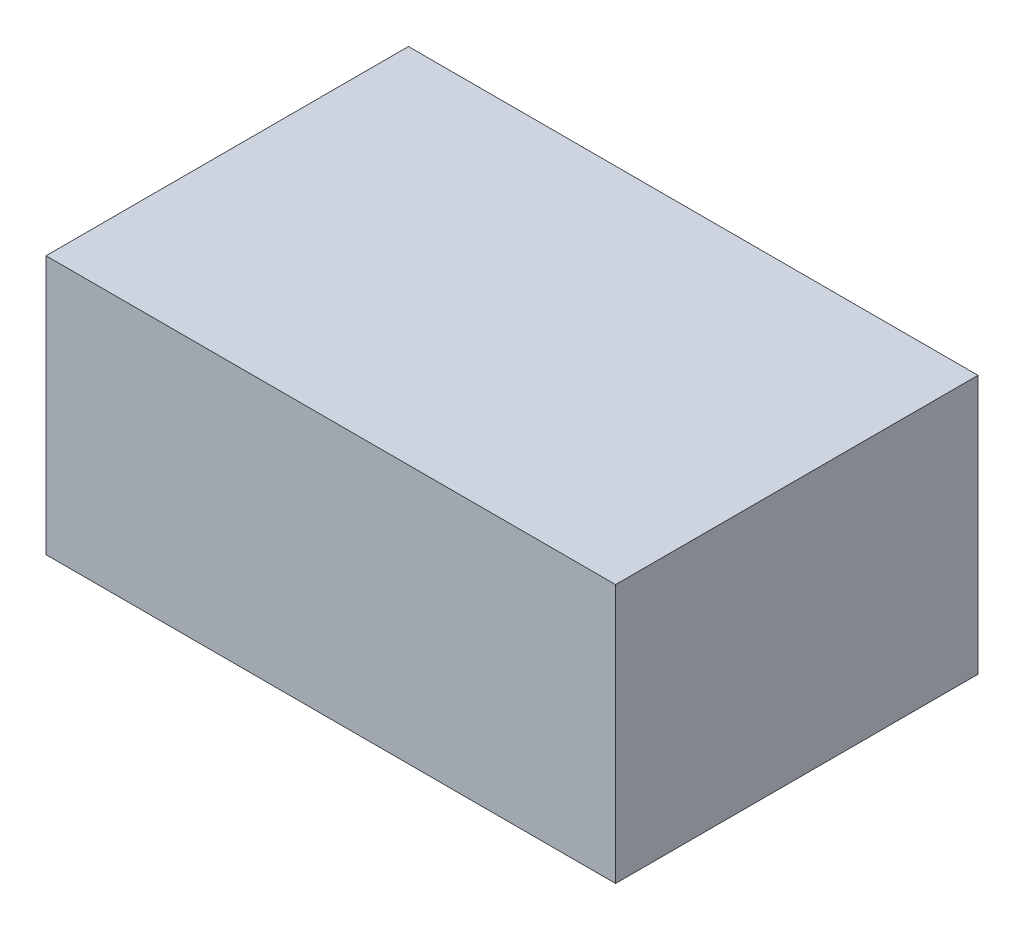
ISO-10303-21;
HEADER;
FILE_DESCRIPTION(('STEP AP214'),'2;1');
FILE_NAME('part.step','',(''),(''),'','','');
FILE_SCHEMA(('AUTOMOTIVE_DESIGN { 1 0 10303 214 1 1 1 1 }'));
ENDSEC;
DATA;
#1=APPLICATION_CONTEXT('core data for automotive mechanical design processes');
#2=APPLICATION_PROTOCOL_DEFINITION('international standard','automotive_design',2000,#1);
#3=PRODUCT_CONTEXT('',#1,'mechanical');
#4=PRODUCT('Part','Part','',(#3));
#5=PRODUCT_RELATED_PRODUCT_CATEGORY('part','',(#4));
#6=PRODUCT_DEFINITION_FORMATION('','',#4);
#7=PRODUCT_DEFINITION_CONTEXT('part definition',#1,'design');
#8=PRODUCT_DEFINITION('design','',#6,#7);
#9=PRODUCT_DEFINITION_SHAPE('','',#8);
#10=(LENGTH_UNIT() NAMED_UNIT(*) SI_UNIT(.MILLI.,.METRE.));
#11=(NAMED_UNIT(*) PLANE_ANGLE_UNIT() SI_UNIT($,.RADIAN.));
#12=(NAMED_UNIT(*) SI_UNIT($,.STERADIAN.) SOLID_ANGLE_UNIT());
#13=UNCERTAINTY_MEASURE_WITH_UNIT(LENGTH_MEASURE(1.E-05),#10,'distance_accuracy_value','');
#14=(GEOMETRIC_REPRESENTATION_CONTEXT(3) GLOBAL_UNCERTAINTY_ASSIGNED_CONTEXT((#13)) GLOBAL_UNIT_ASSIGNED_CONTEXT((#10,
#11,#12)) REPRESENTATION_CONTEXT('',''));
#15=CARTESIAN_POINT('',(0.,0.,0.));
#16=DIRECTION('',(0.,0.,1.));
#17=DIRECTION('',(1.,0.,0.));
#18=AXIS2_PLACEMENT_3D('',#15,#16,#17);
#19=CARTESIAN_POINT('',(27.5,-12.5,35.));
#20=DIRECTION('',(-1.,0.,0.));
#21=DIRECTION('',(0.,0.,1.));
#22=AXIS2_PLACEMENT_3D('',#19,#20,#21);
#23=PLANE('',#22);
#24=DIRECTION('',(0.,1.,0.));
#25=VECTOR('',#24,1.);
#26=CARTESIAN_POINT('',(27.5,-12.5,0.));
#27=LINE('',#26,#25);
#28=CARTESIAN_POINT('',(27.5,-12.5,0.));
#29=VERTEX_POINT('',#28);
#30=CARTESIAN_POINT('',(27.5,12.5,0.));
#31=VERTEX_POINT('',#30);
#32=EDGE_CURVE('E113',#29,#31,#27,.T.);
#33=ORIENTED_EDGE('',*,*,#32,.T.);
#34=DIRECTION('',(0.,0.,-1.));
#35=VECTOR('',#34,1.);
#36=CARTESIAN_POINT('',(27.5,12.5,35.));
#37=LINE('',#36,#35);
#38=CARTESIAN_POINT('',(27.5,12.5,35.));
#39=VERTEX_POINT('',#38);
#40=EDGE_CURVE('E11',#39,#31,#37,.T.);
#41=ORIENTED_EDGE('',*,*,#40,.F.);
#42=DIRECTION('',(0.,1.,0.));
#43=VECTOR('',#42,1.);
#44=CARTESIAN_POINT('',(27.5,-12.5,35.));
#45=LINE('',#44,#43);
#46=CARTESIAN_POINT('',(27.5,-12.5,35.));
#47=VERTEX_POINT('',#46);
#48=EDGE_CURVE('E97',#47,#39,#45,.T.);
#49=ORIENTED_EDGE('',*,*,#48,.F.);
#50=DIRECTION('',(0.,0.,-1.));
#51=VECTOR('',#50,1.);
#52=CARTESIAN_POINT('',(27.5,-12.5,35.));
#53=LINE('',#52,#51);
#54=EDGE_CURVE('E109',#47,#29,#53,.T.);
#55=ORIENTED_EDGE('',*,*,#54,.T.);
#56=EDGE_LOOP('',(#33,#41,#49,#55));
#57=FACE_BOUND('',#56,.T.);
#58=ADVANCED_FACE('F45',(#57),#23,.F.);
#59=CARTESIAN_POINT('',(-27.5,12.5,35.));
#60=DIRECTION('',(0.,-1.,0.));
#61=DIRECTION('',(0.,0.,-1.));
#62=AXIS2_PLACEMENT_3D('',#59,#60,#61);
#63=PLANE('',#62);
#64=DIRECTION('',(-1.,0.,0.));
#65=VECTOR('',#64,1.);
#66=CARTESIAN_POINT('',(-27.5,12.5,0.));
#67=LINE('',#66,#65);
#68=CARTESIAN_POINT('',(-27.5,12.5,0.));
#69=VERTEX_POINT('',#68);
#70=EDGE_CURVE('E102',#31,#69,#67,.T.);
#71=ORIENTED_EDGE('',*,*,#70,.T.);
#72=DIRECTION('',(0.,0.,-1.));
#73=VECTOR('',#72,1.);
#74=CARTESIAN_POINT('',(-27.5,12.5,35.));
#75=LINE('',#74,#73);
#76=CARTESIAN_POINT('',(-27.5,12.5,35.));
#77=VERTEX_POINT('',#76);
#78=EDGE_CURVE('E54',#77,#69,#75,.T.);
#79=ORIENTED_EDGE('',*,*,#78,.F.);
#80=DIRECTION('',(-1.,0.,0.));
#81=VECTOR('',#80,1.);
#82=CARTESIAN_POINT('',(-27.5,12.5,35.));
#83=LINE('',#82,#81);
#84=EDGE_CURVE('E92',#39,#77,#83,.T.);
#85=ORIENTED_EDGE('',*,*,#84,.F.);
#86=ORIENTED_EDGE('',*,*,#40,.T.);
#87=EDGE_LOOP('',(#71,#79,#85,#86));
#88=FACE_BOUND('',#87,.T.);
#89=ADVANCED_FACE('F101',(#88),#63,.F.);
#90=CARTESIAN_POINT('',(-27.5,-12.5,35.));
#91=DIRECTION('',(1.,0.,0.));
#92=DIRECTION('',(0.,0.,-1.));
#93=AXIS2_PLACEMENT_3D('',#90,#91,#92);
#94=PLANE('',#93);
#95=DIRECTION('',(0.,-1.,0.));
#96=VECTOR('',#95,1.);
#97=CARTESIAN_POINT('',(-27.5,-12.5,0.));
#98=LINE('',#97,#96);
#99=CARTESIAN_POINT('',(-27.5,-12.5,0.));
#100=VERTEX_POINT('',#99);
#101=EDGE_CURVE('E79',#69,#100,#98,.T.);
#102=ORIENTED_EDGE('',*,*,#101,.T.);
#103=DIRECTION('',(0.,0.,-1.));
#104=VECTOR('',#103,1.);
#105=CARTESIAN_POINT('',(-27.5,-12.5,35.));
#106=LINE('',#105,#104);
#107=CARTESIAN_POINT('',(-27.5,-12.5,35.));
#108=VERTEX_POINT('',#107);
#109=EDGE_CURVE('E104',#108,#100,#106,.T.);
#110=ORIENTED_EDGE('',*,*,#109,.F.);
#111=DIRECTION('',(0.,-1.,0.));
#112=VECTOR('',#111,1.);
#113=CARTESIAN_POINT('',(-27.5,-12.5,35.));
#114=LINE('',#113,#112);
#115=EDGE_CURVE('E95',#77,#108,#114,.T.);
#116=ORIENTED_EDGE('',*,*,#115,.F.);
#117=ORIENTED_EDGE('',*,*,#78,.T.);
#118=EDGE_LOOP('',(#102,#110,#116,#117));
#119=FACE_BOUND('',#118,.T.);
#120=ADVANCED_FACE('F105',(#119),#94,.F.);
#121=CARTESIAN_POINT('',(-27.5,-12.5,35.));
#122=DIRECTION('',(0.,1.,0.));
#123=DIRECTION('',(0.,0.,1.));
#124=AXIS2_PLACEMENT_3D('',#121,#122,#123);
#125=PLANE('',#124);
#126=DIRECTION('',(1.,0.,0.));
#127=VECTOR('',#126,1.);
#128=CARTESIAN_POINT('',(-27.5,-12.5,0.));
#129=LINE('',#128,#127);
#130=EDGE_CURVE('E85',#100,#29,#129,.T.);
#131=ORIENTED_EDGE('',*,*,#130,.T.);
#132=ORIENTED_EDGE('',*,*,#54,.F.);
#133=DIRECTION('',(1.,0.,0.));
#134=VECTOR('',#133,1.);
#135=CARTESIAN_POINT('',(-27.5,-12.5,35.));
#136=LINE('',#135,#134);
#137=EDGE_CURVE('E62',#108,#47,#136,.T.);
#138=ORIENTED_EDGE('',*,*,#137,.F.);
#139=ORIENTED_EDGE('',*,*,#109,.T.);
#140=EDGE_LOOP('',(#131,#132,#138,#139));
#141=FACE_BOUND('',#140,.T.);
#142=ADVANCED_FACE('F126',(#141),#125,.F.);
#143=CARTESIAN_POINT('',(0.,0.,35.));
#144=DIRECTION('',(0.,0.,-1.));
#145=DIRECTION('',(-1.,0.,0.));
#146=AXIS2_PLACEMENT_3D('',#143,#144,#145);
#147=PLANE('',#146);
#148=ORIENTED_EDGE('',*,*,#48,.T.);
#149=ORIENTED_EDGE('',*,*,#84,.T.);
#150=ORIENTED_EDGE('',*,*,#115,.T.);
#151=ORIENTED_EDGE('',*,*,#137,.T.);
#152=EDGE_LOOP('',(#148,#149,#150,#151));
#153=FACE_BOUND('',#152,.T.);
#154=ADVANCED_FACE('F93',(#153),#147,.F.);
#155=CARTESIAN_POINT('',(0.,0.,0.));
#156=DIRECTION('',(0.,0.,-1.));
#157=DIRECTION('',(-1.,0.,0.));
#158=AXIS2_PLACEMENT_3D('',#155,#156,#157);
#159=PLANE('',#158);
#160=ORIENTED_EDGE('',*,*,#32,.F.);
#161=ORIENTED_EDGE('',*,*,#130,.F.);
#162=ORIENTED_EDGE('',*,*,#101,.F.);
#163=ORIENTED_EDGE('',*,*,#70,.F.);
#164=EDGE_LOOP('',(#160,#161,#162,#163));
#165=FACE_BOUND('',#164,.T.);
#166=ADVANCED_FACE('F129',(#165),#159,.T.);
#167=CLOSED_SHELL('',(#58,#89,#120,#142,#154,#166));
#168=MANIFOLD_SOLID_BREP('B2',#167);
#169=ADVANCED_BREP_SHAPE_REPRESENTATION('',(#18,#168),#14);
#170=SHAPE_DEFINITION_REPRESENTATION(#9,#169);
ENDSEC;
END-ISO-10303-21;
